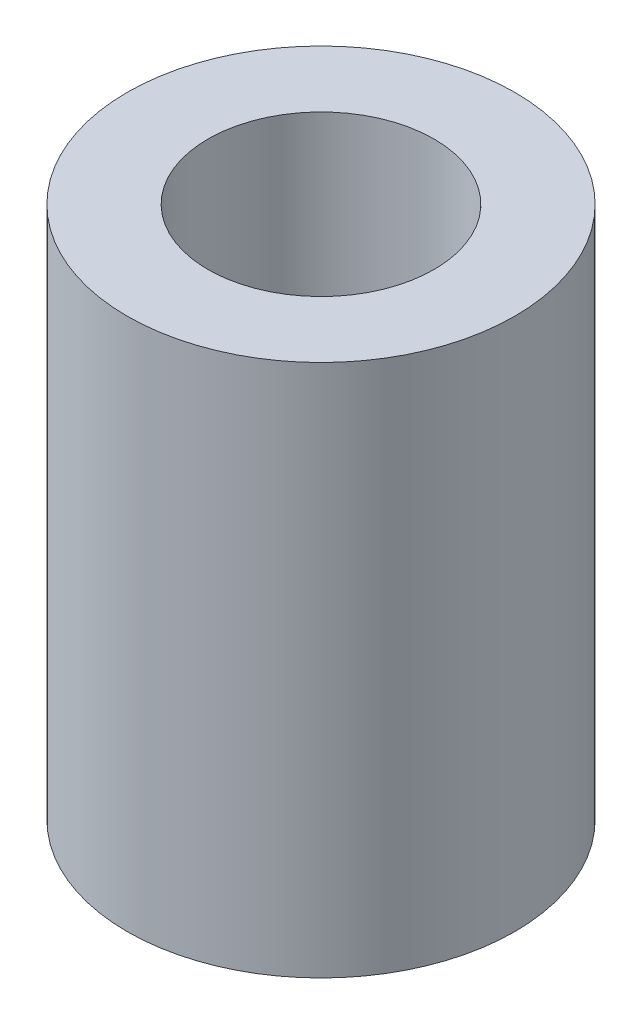
ISO-10303-21;
HEADER;
FILE_DESCRIPTION(('STEP AP214'),'2;1');
FILE_NAME('part.step','',(''),(''),'','','');
FILE_SCHEMA(('AUTOMOTIVE_DESIGN { 1 0 10303 214 1 1 1 1 }'));
ENDSEC;
DATA;
#1=APPLICATION_CONTEXT('core data for automotive mechanical design processes');
#2=APPLICATION_PROTOCOL_DEFINITION('international standard','automotive_design',2000,#1);
#3=PRODUCT_CONTEXT('',#1,'mechanical');
#4=PRODUCT('Part','Part','',(#3));
#5=PRODUCT_RELATED_PRODUCT_CATEGORY('part','',(#4));
#6=PRODUCT_DEFINITION_FORMATION('','',#4);
#7=PRODUCT_DEFINITION_CONTEXT('part definition',#1,'design');
#8=PRODUCT_DEFINITION('design','',#6,#7);
#9=PRODUCT_DEFINITION_SHAPE('','',#8);
#10=(LENGTH_UNIT() NAMED_UNIT(*) SI_UNIT(.MILLI.,.METRE.));
#11=(NAMED_UNIT(*) PLANE_ANGLE_UNIT() SI_UNIT($,.RADIAN.));
#12=(NAMED_UNIT(*) SI_UNIT($,.STERADIAN.) SOLID_ANGLE_UNIT());
#13=UNCERTAINTY_MEASURE_WITH_UNIT(LENGTH_MEASURE(1.E-05),#10,'distance_accuracy_value','');
#14=(GEOMETRIC_REPRESENTATION_CONTEXT(3) GLOBAL_UNCERTAINTY_ASSIGNED_CONTEXT((#13)) GLOBAL_UNIT_ASSIGNED_CONTEXT((#10,
#11,#12)) REPRESENTATION_CONTEXT('',''));
#15=CARTESIAN_POINT('',(0.,0.,0.));
#16=DIRECTION('',(0.,0.,1.));
#17=DIRECTION('',(1.,0.,0.));
#18=AXIS2_PLACEMENT_3D('',#15,#16,#17);
#19=CARTESIAN_POINT('',(0.,9.9,0.));
#20=DIRECTION('',(0.,1.,0.));
#21=DIRECTION('',(0.,0.,1.));
#22=AXIS2_PLACEMENT_3D('',#19,#20,#21);
#23=PLANE('',#22);
#24=CARTESIAN_POINT('',(0.,9.9,0.));
#25=DIRECTION('',(0.,1.,0.));
#26=DIRECTION('',(0.,0.,1.));
#27=AXIS2_PLACEMENT_3D('',#24,#25,#26);
#28=CIRCLE('',#27,3.6);
#29=CARTESIAN_POINT('',(0.,9.9,-3.6));
#30=VERTEX_POINT('',#29);
#31=EDGE_CURVE('E10',#30,#30,#28,.T.);
#32=ORIENTED_EDGE('',*,*,#31,.T.);
#33=EDGE_LOOP('',(#32));
#34=FACE_BOUND('',#33,.T.);
#35=CARTESIAN_POINT('',(0.,9.9,0.));
#36=DIRECTION('',(0.,1.,0.));
#37=DIRECTION('',(0.,0.,1.));
#38=AXIS2_PLACEMENT_3D('',#35,#36,#37);
#39=CIRCLE('',#38,2.1);
#40=CARTESIAN_POINT('',(0.,9.9,-2.1));
#41=VERTEX_POINT('',#40);
#42=EDGE_CURVE('E58',#41,#41,#39,.T.);
#43=ORIENTED_EDGE('',*,*,#42,.F.);
#44=EDGE_LOOP('',(#43));
#45=FACE_BOUND('',#44,.T.);
#46=ADVANCED_FACE('F45',(#34,#45),#23,.T.);
#47=CARTESIAN_POINT('',(0.,0.,0.));
#48=DIRECTION('',(0.,1.,0.));
#49=DIRECTION('',(0.,0.,1.));
#50=AXIS2_PLACEMENT_3D('',#47,#48,#49);
#51=PLANE('',#50);
#52=CARTESIAN_POINT('',(0.,0.,0.));
#53=DIRECTION('',(0.,1.,0.));
#54=DIRECTION('',(0.,0.,1.));
#55=AXIS2_PLACEMENT_3D('',#52,#53,#54);
#56=CIRCLE('',#55,3.6);
#57=CARTESIAN_POINT('',(0.,0.,-3.6));
#58=VERTEX_POINT('',#57);
#59=EDGE_CURVE('E49',#58,#58,#56,.T.);
#60=ORIENTED_EDGE('',*,*,#59,.F.);
#61=EDGE_LOOP('',(#60));
#62=FACE_BOUND('',#61,.T.);
#63=CARTESIAN_POINT('',(0.,0.,0.));
#64=DIRECTION('',(0.,1.,0.));
#65=DIRECTION('',(0.,0.,1.));
#66=AXIS2_PLACEMENT_3D('',#63,#64,#65);
#67=CIRCLE('',#66,2.1);
#68=CARTESIAN_POINT('',(0.,0.,-2.1));
#69=VERTEX_POINT('',#68);
#70=EDGE_CURVE('E60',#69,#69,#67,.T.);
#71=ORIENTED_EDGE('',*,*,#70,.T.);
#72=EDGE_LOOP('',(#71));
#73=FACE_BOUND('',#72,.T.);
#74=ADVANCED_FACE('F72',(#62,#73),#51,.F.);
#75=CARTESIAN_POINT('',(0.,9.9,0.));
#76=DIRECTION('',(0.,-1.,0.));
#77=DIRECTION('',(0.,0.,-1.));
#78=AXIS2_PLACEMENT_3D('',#75,#76,#77);
#79=CYLINDRICAL_SURFACE('',#78,3.6);
#80=CARTESIAN_POINT('',(0.,9.9,-3.6));
#81=CARTESIAN_POINT('',(0.,9.796875,-3.6));
#82=CARTESIAN_POINT('',(0.,9.69375,-3.6));
#83=CARTESIAN_POINT('',(0.,9.4875,-3.6));
#84=CARTESIAN_POINT('',(0.,9.384375,-3.6));
#85=CARTESIAN_POINT('',(0.,9.178125,-3.6));
#86=CARTESIAN_POINT('',(0.,9.075,-3.6));
#87=CARTESIAN_POINT('',(0.,8.86875,-3.6));
#88=CARTESIAN_POINT('',(0.,8.765625,-3.6));
#89=CARTESIAN_POINT('',(0.,8.559375,-3.6));
#90=CARTESIAN_POINT('',(0.,8.45625,-3.6));
#91=CARTESIAN_POINT('',(0.,8.25,-3.6));
#92=CARTESIAN_POINT('',(0.,8.146875,-3.6));
#93=CARTESIAN_POINT('',(0.,7.940625,-3.6));
#94=CARTESIAN_POINT('',(0.,7.8375,-3.6));
#95=CARTESIAN_POINT('',(0.,7.63125,-3.6));
#96=CARTESIAN_POINT('',(0.,7.528125,-3.6));
#97=CARTESIAN_POINT('',(0.,7.321875,-3.6));
#98=CARTESIAN_POINT('',(0.,7.21875,-3.6));
#99=CARTESIAN_POINT('',(0.,7.0125,-3.6));
#100=CARTESIAN_POINT('',(0.,6.909375,-3.6));
#101=CARTESIAN_POINT('',(0.,6.703125,-3.6));
#102=CARTESIAN_POINT('',(0.,6.6,-3.6));
#103=CARTESIAN_POINT('',(0.,6.39375,-3.6));
#104=CARTESIAN_POINT('',(0.,6.290625,-3.6));
#105=CARTESIAN_POINT('',(0.,6.084375,-3.6));
#106=CARTESIAN_POINT('',(0.,5.98125,-3.6));
#107=CARTESIAN_POINT('',(0.,5.775,-3.6));
#108=CARTESIAN_POINT('',(0.,5.671875,-3.6));
#109=CARTESIAN_POINT('',(0.,5.465625,-3.6));
#110=CARTESIAN_POINT('',(0.,5.3625,-3.6));
#111=CARTESIAN_POINT('',(0.,5.15625,-3.6));
#112=CARTESIAN_POINT('',(0.,5.053125,-3.6));
#113=CARTESIAN_POINT('',(0.,4.846875,-3.6));
#114=CARTESIAN_POINT('',(0.,4.74375,-3.6));
#115=CARTESIAN_POINT('',(0.,4.5375,-3.6));
#116=CARTESIAN_POINT('',(0.,4.434375,-3.6));
#117=CARTESIAN_POINT('',(0.,4.228125,-3.6));
#118=CARTESIAN_POINT('',(0.,4.125,-3.6));
#119=CARTESIAN_POINT('',(0.,3.91875,-3.6));
#120=CARTESIAN_POINT('',(0.,3.815625,-3.6));
#121=CARTESIAN_POINT('',(0.,3.609375,-3.6));
#122=CARTESIAN_POINT('',(0.,3.50625,-3.6));
#123=CARTESIAN_POINT('',(0.,3.3,-3.6));
#124=CARTESIAN_POINT('',(0.,3.196875,-3.6));
#125=CARTESIAN_POINT('',(0.,2.990625,-3.6));
#126=CARTESIAN_POINT('',(0.,2.8875,-3.6));
#127=CARTESIAN_POINT('',(0.,2.68125,-3.6));
#128=CARTESIAN_POINT('',(0.,2.578125,-3.6));
#129=CARTESIAN_POINT('',(0.,2.371875,-3.6));
#130=CARTESIAN_POINT('',(0.,2.26875,-3.6));
#131=CARTESIAN_POINT('',(0.,2.0625,-3.6));
#132=CARTESIAN_POINT('',(0.,1.959375,-3.6));
#133=CARTESIAN_POINT('',(0.,1.753125,-3.6));
#134=CARTESIAN_POINT('',(0.,1.65,-3.6));
#135=CARTESIAN_POINT('',(0.,1.44375,-3.6));
#136=CARTESIAN_POINT('',(0.,1.340625,-3.6));
#137=CARTESIAN_POINT('',(0.,1.134375,-3.6));
#138=CARTESIAN_POINT('',(0.,1.03125,-3.6));
#139=CARTESIAN_POINT('',(0.,0.825,-3.6));
#140=CARTESIAN_POINT('',(0.,0.721875,-3.6));
#141=CARTESIAN_POINT('',(0.,0.515625,-3.6));
#142=CARTESIAN_POINT('',(0.,0.4125,-3.6));
#143=CARTESIAN_POINT('',(0.,0.20625,-3.6));
#144=CARTESIAN_POINT('',(0.,0.103125,-3.6));
#145=CARTESIAN_POINT('',(0.,0.,-3.6));
#146=B_SPLINE_CURVE_WITH_KNOTS('',3,(#80,#81,#82,#83,#84,#85,#86,#87,#88,#89,#90,#91,#92,#93,
#94,#95,#96,#97,#98,#99,#100,#101,#102,#103,#104,#105,#106,#107,#108,#109,#110,#111,#112,#113,
#114,#115,#116,#117,#118,#119,#120,#121,#122,#123,#124,#125,#126,#127,#128,#129,#130,#131,#132,
#133,#134,#135,#136,#137,#138,#139,#140,#141,#142,#143,#144,#145),.UNSPECIFIED.,.F.,.F.,(4,2,2,
2,2,2,2,2,2,2,2,2,2,2,2,2,2,2,2,2,2,2,2,2,2,2,2,2,2,2,2,2,4),(0.,0.309375000000001,
0.618750000000001,0.928125,1.2375,1.546875,1.85625,2.165625,2.475,2.784375,3.09375,3.403125,
3.7125,4.021875,4.33125,4.640625,4.95,5.259375,5.56875,5.878125,6.1875,6.496875,6.80625,
7.115625,7.425,7.734375,8.04375,8.353125,8.6625,8.971875,9.28125,9.590625,9.9),.UNSPECIFIED.);
#147=EDGE_CURVE('BSEAM47',#30,#58,#146,.T.);
#148=ORIENTED_EDGE('',*,*,#31,.F.);
#149=ORIENTED_EDGE('',*,*,#59,.T.);
#150=ORIENTED_EDGE('',*,*,#147,.T.);
#151=ORIENTED_EDGE('',*,*,#147,.F.);
#152=EDGE_LOOP('',(#148,#150,#149,#151));
#153=FACE_BOUND('',#152,.T.);
#154=ADVANCED_FACE('F47',(#153),#79,.T.);
#155=CARTESIAN_POINT('',(0.,9.9,0.));
#156=DIRECTION('',(0.,-1.,0.));
#157=DIRECTION('',(0.,0.,-1.));
#158=AXIS2_PLACEMENT_3D('',#155,#156,#157);
#159=CYLINDRICAL_SURFACE('',#158,2.1);
#160=CARTESIAN_POINT('',(0.,9.9,-2.1));
#161=CARTESIAN_POINT('',(0.,9.796875,-2.1));
#162=CARTESIAN_POINT('',(0.,9.69375,-2.1));
#163=CARTESIAN_POINT('',(0.,9.4875,-2.1));
#164=CARTESIAN_POINT('',(0.,9.384375,-2.1));
#165=CARTESIAN_POINT('',(0.,9.178125,-2.1));
#166=CARTESIAN_POINT('',(0.,9.075,-2.1));
#167=CARTESIAN_POINT('',(0.,8.86875,-2.1));
#168=CARTESIAN_POINT('',(0.,8.765625,-2.1));
#169=CARTESIAN_POINT('',(0.,8.559375,-2.1));
#170=CARTESIAN_POINT('',(0.,8.45625,-2.1));
#171=CARTESIAN_POINT('',(0.,8.25,-2.1));
#172=CARTESIAN_POINT('',(0.,8.146875,-2.1));
#173=CARTESIAN_POINT('',(0.,7.940625,-2.1));
#174=CARTESIAN_POINT('',(0.,7.8375,-2.1));
#175=CARTESIAN_POINT('',(0.,7.63125,-2.1));
#176=CARTESIAN_POINT('',(0.,7.528125,-2.1));
#177=CARTESIAN_POINT('',(0.,7.321875,-2.1));
#178=CARTESIAN_POINT('',(0.,7.21875,-2.1));
#179=CARTESIAN_POINT('',(0.,7.0125,-2.1));
#180=CARTESIAN_POINT('',(0.,6.909375,-2.1));
#181=CARTESIAN_POINT('',(0.,6.703125,-2.1));
#182=CARTESIAN_POINT('',(0.,6.6,-2.1));
#183=CARTESIAN_POINT('',(0.,6.39375,-2.1));
#184=CARTESIAN_POINT('',(0.,6.290625,-2.1));
#185=CARTESIAN_POINT('',(0.,6.084375,-2.1));
#186=CARTESIAN_POINT('',(0.,5.98125,-2.1));
#187=CARTESIAN_POINT('',(0.,5.775,-2.1));
#188=CARTESIAN_POINT('',(0.,5.671875,-2.1));
#189=CARTESIAN_POINT('',(0.,5.465625,-2.1));
#190=CARTESIAN_POINT('',(0.,5.3625,-2.1));
#191=CARTESIAN_POINT('',(0.,5.15625,-2.1));
#192=CARTESIAN_POINT('',(0.,5.053125,-2.1));
#193=CARTESIAN_POINT('',(0.,4.846875,-2.1));
#194=CARTESIAN_POINT('',(0.,4.74375,-2.1));
#195=CARTESIAN_POINT('',(0.,4.5375,-2.1));
#196=CARTESIAN_POINT('',(0.,4.434375,-2.1));
#197=CARTESIAN_POINT('',(0.,4.228125,-2.1));
#198=CARTESIAN_POINT('',(0.,4.125,-2.1));
#199=CARTESIAN_POINT('',(0.,3.91875,-2.1));
#200=CARTESIAN_POINT('',(0.,3.815625,-2.1));
#201=CARTESIAN_POINT('',(0.,3.609375,-2.1));
#202=CARTESIAN_POINT('',(0.,3.50625,-2.1));
#203=CARTESIAN_POINT('',(0.,3.3,-2.1));
#204=CARTESIAN_POINT('',(0.,3.196875,-2.1));
#205=CARTESIAN_POINT('',(0.,2.990625,-2.1));
#206=CARTESIAN_POINT('',(0.,2.8875,-2.1));
#207=CARTESIAN_POINT('',(0.,2.68125,-2.1));
#208=CARTESIAN_POINT('',(0.,2.578125,-2.1));
#209=CARTESIAN_POINT('',(0.,2.371875,-2.1));
#210=CARTESIAN_POINT('',(0.,2.26875,-2.1));
#211=CARTESIAN_POINT('',(0.,2.0625,-2.1));
#212=CARTESIAN_POINT('',(0.,1.959375,-2.1));
#213=CARTESIAN_POINT('',(0.,1.753125,-2.1));
#214=CARTESIAN_POINT('',(0.,1.65,-2.1));
#215=CARTESIAN_POINT('',(0.,1.44375,-2.1));
#216=CARTESIAN_POINT('',(0.,1.340625,-2.1));
#217=CARTESIAN_POINT('',(0.,1.134375,-2.1));
#218=CARTESIAN_POINT('',(0.,1.03125,-2.1));
#219=CARTESIAN_POINT('',(0.,0.825,-2.1));
#220=CARTESIAN_POINT('',(0.,0.721875,-2.1));
#221=CARTESIAN_POINT('',(0.,0.515625,-2.1));
#222=CARTESIAN_POINT('',(0.,0.4125,-2.1));
#223=CARTESIAN_POINT('',(0.,0.20625,-2.1));
#224=CARTESIAN_POINT('',(0.,0.103125,-2.1));
#225=CARTESIAN_POINT('',(0.,0.,-2.1));
#226=B_SPLINE_CURVE_WITH_KNOTS('',3,(#160,#161,#162,#163,#164,#165,#166,#167,#168,#169,#170,
#171,#172,#173,#174,#175,#176,#177,#178,#179,#180,#181,#182,#183,#184,#185,#186,#187,#188,#189,
#190,#191,#192,#193,#194,#195,#196,#197,#198,#199,#200,#201,#202,#203,#204,#205,#206,#207,#208,
#209,#210,#211,#212,#213,#214,#215,#216,#217,#218,#219,#220,#221,#222,#223,#224,#225),
.UNSPECIFIED.,.F.,.F.,(4,2,2,2,2,2,2,2,2,2,2,2,2,2,2,2,2,2,2,2,2,2,2,2,2,2,2,2,2,2,2,2,4),(0.,
0.309375000000001,0.618750000000001,0.928125,1.2375,1.546875,1.85625,2.165625,2.475,2.784375,
3.09375,3.403125,3.7125,4.021875,4.33125,4.640625,4.95,5.259375,5.56875,5.878125,6.1875,
6.496875,6.80625,7.115625,7.425,7.734375,8.04375,8.353125,8.6625,8.971875,9.28125,9.590625,9.9),.UNSPECIFIED.);
#227=EDGE_CURVE('BSEAM68',#41,#69,#226,.T.);
#228=ORIENTED_EDGE('',*,*,#42,.T.);
#229=ORIENTED_EDGE('',*,*,#70,.F.);
#230=ORIENTED_EDGE('',*,*,#227,.T.);
#231=ORIENTED_EDGE('',*,*,#227,.F.);
#232=EDGE_LOOP('',(#228,#230,#229,#231));
#233=FACE_BOUND('',#232,.T.);
#234=ADVANCED_FACE('F68',(#233),#159,.F.);
#235=CLOSED_SHELL('',(#46,#74,#154,#234));
#236=MANIFOLD_SOLID_BREP('B2',#235);
#237=ADVANCED_BREP_SHAPE_REPRESENTATION('',(#18,#236),#14);
#238=SHAPE_DEFINITION_REPRESENTATION(#9,#237);
ENDSEC;
END-ISO-10303-21;
